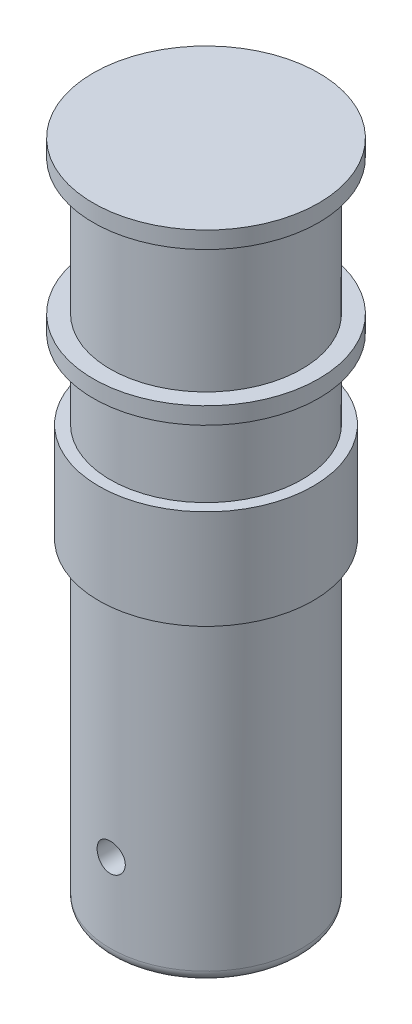
ISO-10303-21;
HEADER;
FILE_DESCRIPTION(('STEP AP214'),'2;1');
FILE_NAME('part.step','',(''),(''),'','','');
FILE_SCHEMA(('AUTOMOTIVE_DESIGN { 1 0 10303 214 1 1 1 1 }'));
ENDSEC;
DATA;
#1=APPLICATION_CONTEXT('core data for automotive mechanical design processes');
#2=APPLICATION_PROTOCOL_DEFINITION('international standard','automotive_design',2000,#1);
#3=PRODUCT_CONTEXT('',#1,'mechanical');
#4=PRODUCT('Part','Part','',(#3));
#5=PRODUCT_RELATED_PRODUCT_CATEGORY('part','',(#4));
#6=PRODUCT_DEFINITION_FORMATION('','',#4);
#7=PRODUCT_DEFINITION_CONTEXT('part definition',#1,'design');
#8=PRODUCT_DEFINITION('design','',#6,#7);
#9=PRODUCT_DEFINITION_SHAPE('','',#8);
#10=(LENGTH_UNIT() NAMED_UNIT(*) SI_UNIT(.MILLI.,.METRE.));
#11=(NAMED_UNIT(*) PLANE_ANGLE_UNIT() SI_UNIT($,.RADIAN.));
#12=(NAMED_UNIT(*) SI_UNIT($,.STERADIAN.) SOLID_ANGLE_UNIT());
#13=UNCERTAINTY_MEASURE_WITH_UNIT(LENGTH_MEASURE(1.E-05),#10,'distance_accuracy_value','');
#14=(GEOMETRIC_REPRESENTATION_CONTEXT(3) GLOBAL_UNCERTAINTY_ASSIGNED_CONTEXT((#13)) GLOBAL_UNIT_ASSIGNED_CONTEXT((#10,
#11,#12)) REPRESENTATION_CONTEXT('',''));
#15=CARTESIAN_POINT('',(0.,0.,0.));
#16=DIRECTION('',(0.,0.,1.));
#17=DIRECTION('',(1.,0.,0.));
#18=AXIS2_PLACEMENT_3D('',#15,#16,#17);
#19=CARTESIAN_POINT('',(0.,-30.,0.));
#20=DIRECTION('',(0.,-1.,0.));
#21=DIRECTION('',(1.,0.,0.));
#22=AXIS2_PLACEMENT_3D('',#19,#20,#21);
#23=PLANE('',#22);
#24=CARTESIAN_POINT('',(0.,-30.,0.));
#25=DIRECTION('',(0.,1.,0.));
#26=DIRECTION('',(-1.,0.,0.));
#27=AXIS2_PLACEMENT_3D('',#24,#25,#26);
#28=CIRCLE('',#27,4.);
#29=CARTESIAN_POINT('',(-4.,-30.,0.));
#30=VERTEX_POINT('',#29);
#31=EDGE_CURVE('E54',#30,#30,#28,.T.);
#32=ORIENTED_EDGE('',*,*,#31,.F.);
#33=EDGE_LOOP('',(#32));
#34=FACE_BOUND('',#33,.T.);
#35=ADVANCED_FACE('F34',(#34),#23,.T.);
#36=CARTESIAN_POINT('',(0.,15.,0.));
#37=DIRECTION('',(0.,1.,0.));
#38=DIRECTION('',(-1.,0.,0.));
#39=AXIS2_PLACEMENT_3D('',#36,#37,#38);
#40=CYLINDRICAL_SURFACE('',#39,4.);
#41=CARTESIAN_POINT('',(-1.25,-36.,3.79967103839267));
#42=CARTESIAN_POINT('',(-1.24999953780047,-35.9316529638907,3.79967145961936));
#43=CARTESIAN_POINT('',(-1.24437538791494,-35.8633012312968,3.80153531505043));
#44=CARTESIAN_POINT('',(-1.22209175401327,-35.7286058391222,3.80875638998877));
#45=CARTESIAN_POINT('',(-1.20542928782515,-35.6622627272678,3.81411455353136));
#46=CARTESIAN_POINT('',(-1.16169788223559,-35.533555098068,3.8276593883596));
#47=CARTESIAN_POINT('',(-1.13464735736677,-35.4711837668943,3.83584105194317));
#48=CARTESIAN_POINT('',(-1.07096914173157,-35.351847304136,3.85410406218688));
#49=CARTESIAN_POINT('',(-1.03433975905632,-35.2948831300399,3.86418574435841));
#50=CARTESIAN_POINT('',(-0.951196070622293,-35.1860211325065,3.8855012766862));
#51=CARTESIAN_POINT('',(-0.904409399720399,-35.134336390564,3.8967612338478));
#52=CARTESIAN_POINT('',(-0.802862046455494,-35.0394039867908,3.91894245860336));
#53=CARTESIAN_POINT('',(-0.748100252518563,-34.9961575030552,3.92986367872627));
#54=CARTESIAN_POINT('',(-0.630625912493361,-34.9183889369888,3.95043553390078));
#55=CARTESIAN_POINT('',(-0.567761556520095,-34.8840862961685,3.9600518456278));
#56=CARTESIAN_POINT('',(-0.436804232853405,-34.8266239501445,3.97662551833019));
#57=CARTESIAN_POINT('',(-0.368712498487054,-34.8034616258504,3.98358350419919));
#58=CARTESIAN_POINT('',(-0.231464356966101,-34.7696488719029,3.99387175820862));
#59=CARTESIAN_POINT('',(-0.162405715468218,-34.7586342502121,3.99730738984143));
#60=CARTESIAN_POINT('',(-0.0233408139845228,-34.7482756535625,4.00053595876015));
#61=CARTESIAN_POINT('',(0.0466652269730812,-34.7489290256412,4.00032972410065));
#62=CARTESIAN_POINT('',(0.183074480354733,-34.7616482915859,3.99637116132537));
#63=CARTESIAN_POINT('',(0.249518634314043,-34.773319383513,3.99274150972157));
#64=CARTESIAN_POINT('',(0.37945306334777,-34.807094990043,3.98249482560855));
#65=CARTESIAN_POINT('',(0.442943145481195,-34.8292001850865,3.97587759827134));
#66=CARTESIAN_POINT('',(0.566078103154782,-34.8834701890749,3.96023459729533));
#67=CARTESIAN_POINT('',(0.625666405622832,-34.915754808563,3.95118033616957));
#68=CARTESIAN_POINT('',(0.73870251115203,-34.9893710997046,3.93161722953562));
#69=CARTESIAN_POINT('',(0.792148756208837,-35.0307050591378,3.92110801644584));
#70=CARTESIAN_POINT('',(0.89373769845388,-35.1232736348013,3.89923670734646));
#71=CARTESIAN_POINT('',(0.941566549094178,-35.1748490688412,3.88785731989084));
#72=CARTESIAN_POINT('',(1.02798974259538,-35.2853951018245,3.86590615440413));
#73=CARTESIAN_POINT('',(1.06658299775341,-35.344366570575,3.85533447159847));
#74=CARTESIAN_POINT('',(1.13380465019765,-35.4689174688598,3.83610846648974));
#75=CARTESIAN_POINT('',(1.16231680702682,-35.5345634090424,3.82747690354324));
#76=CARTESIAN_POINT('',(1.20778345948513,-35.6700594918954,3.81337545338913));
#77=CARTESIAN_POINT('',(1.22474210765793,-35.7399081142105,3.80790443033294));
#78=CARTESIAN_POINT('',(1.24601485185708,-35.8788199525658,3.80099563391872));
#79=CARTESIAN_POINT('',(1.25080954353711,-35.9478019962321,3.79940466389696));
#80=CARTESIAN_POINT('',(1.24896744498307,-36.0855897414982,3.80001077463984));
#81=CARTESIAN_POINT('',(1.24233242111456,-36.1543954687005,3.80220727008389));
#82=CARTESIAN_POINT('',(1.21824873513143,-36.2878082966516,3.80998957482874));
#83=CARTESIAN_POINT('',(1.20111831160538,-36.352479274074,3.81547554101732));
#84=CARTESIAN_POINT('',(1.15690373661027,-36.478021791996,3.82911287331661));
#85=CARTESIAN_POINT('',(1.12981796171155,-36.5388927109212,3.83726467412388));
#86=CARTESIAN_POINT('',(1.06557510655875,-36.6570391097718,3.85560539653156));
#87=CARTESIAN_POINT('',(1.02815147488557,-36.7141614155928,3.86584603489733));
#88=CARTESIAN_POINT('',(0.94460640867981,-36.8214903463619,3.88710348972828));
#89=CARTESIAN_POINT('',(0.898482714690782,-36.8716951689253,3.89812050735703));
#90=CARTESIAN_POINT('',(0.796572947753603,-36.9659103659128,3.92024187562679));
#91=CARTESIAN_POINT('',(0.740465649788519,-37.0095777861399,3.9313309228568));
#92=CARTESIAN_POINT('',(0.621451545651397,-37.0868910433212,3.95189059843678));
#93=CARTESIAN_POINT('',(0.558545051108624,-37.120537339311,3.96136130090946));
#94=CARTESIAN_POINT('',(0.428105523331833,-37.1765305624717,3.97756311928512));
#95=CARTESIAN_POINT('',(0.360610184283756,-37.1989592878437,3.984313995612));
#96=CARTESIAN_POINT('',(0.222557254056389,-37.2320725385897,3.99440242648576));
#97=CARTESIAN_POINT('',(0.152000628340356,-37.2427607390835,3.99774104914277));
#98=CARTESIAN_POINT('',(0.0129849366488986,-37.2517910017496,4.00055803404462));
#99=CARTESIAN_POINT('',(-0.0554391919465221,-37.2506284501708,4.0001912940739));
#100=CARTESIAN_POINT('',(-0.191073221923248,-37.2371881889513,3.99600978081049));
#101=CARTESIAN_POINT('',(-0.258283202179568,-37.224911204008,3.99219523232619));
#102=CARTESIAN_POINT('',(-0.388755118480791,-37.1899059907777,3.98159570844796));
#103=CARTESIAN_POINT('',(-0.45205591844948,-37.1673103921546,3.97484847960205));
#104=CARTESIAN_POINT('',(-0.57399842550009,-37.1124291727915,3.9590794558795));
#105=CARTESIAN_POINT('',(-0.632639331274481,-37.0801418900266,3.95005727091358));
#106=CARTESIAN_POINT('',(-0.745761694969688,-37.0055272416555,3.93029896883376));
#107=CARTESIAN_POINT('',(-0.80003460705311,-36.962896477536,3.91951509750962));
#108=CARTESIAN_POINT('',(-0.900820791399316,-36.8693401105565,3.89758736547061));
#109=CARTESIAN_POINT('',(-0.947331733504156,-36.8184120258606,3.88644339784827));
#110=CARTESIAN_POINT('',(-1.03282865911252,-36.7076842801589,3.86461892577438));
#111=CARTESIAN_POINT('',(-1.07151427994711,-36.6476465968834,3.85396600863456));
#112=CARTESIAN_POINT('',(-1.13820470748522,-36.5216018797309,3.83480125279531));
#113=CARTESIAN_POINT('',(-1.16621383403546,-36.4555972735497,3.82628854861386));
#114=CARTESIAN_POINT('',(-1.20871180435792,-36.3252773826853,3.81306560440327));
#115=CARTESIAN_POINT('',(-1.22414939837873,-36.2612974525484,3.80809315043749));
#116=CARTESIAN_POINT('',(-1.24479245816099,-36.1315461679035,3.80139606482399));
#117=CARTESIAN_POINT('',(-1.25000044480778,-36.0657752587985,3.79967063301598));
#118=CARTESIAN_POINT('',(-1.25,-36.,3.79967103839267));
#119=B_SPLINE_CURVE_WITH_KNOTS('',3,(#41,#42,#43,#44,#45,#46,#47,#48,#49,#50,#51,#52,#53,#54,
#55,#56,#57,#58,#59,#60,#61,#62,#63,#64,#65,#66,#67,#68,#69,#70,#71,#72,#73,#74,#75,#76,#77,#78,
#79,#80,#81,#82,#83,#84,#85,#86,#87,#88,#89,#90,#91,#92,#93,#94,#95,#96,#97,#98,#99,#100,#101,
#102,#103,#104,#105,#106,#107,#108,#109,#110,#111,#112,#113,#114,#115,#116,#117,#118),
.UNSPECIFIED.,.T.,.F.,(4,2,2,2,2,2,2,2,2,2,2,2,2,2,2,2,2,2,2,2,2,2,2,2,2,2,2,2,2,2,2,2,2,2,2,2,
2,2,4),(0.,0.204798137548501,0.409651627059736,0.614143644118579,0.818671804924945,
1.02957080550838,1.24049922941123,1.45619821963733,1.67184647417921,1.88083722835533,
2.08978046471774,2.2915098296975,2.49325235190093,2.69746404608409,2.90172742713188,
3.11450338937334,3.32730439853776,3.54248470934454,3.75758763952753,3.96404933287934,
4.17047912219088,4.37093972044362,4.5714330225321,4.7776761330961,4.9839728801188,
5.19881937811511,5.41365603317086,5.62690239290998,5.84008198140585,6.04438802439524,
6.24868074692306,6.45041846514759,6.65219079911652,6.86080693105214,7.06948557772189,
7.28507795501704,7.50058300803822,7.69772354371386,7.89481549188778),.UNSPECIFIED.);
#120=CARTESIAN_POINT('',(-1.25,-36.,3.79967103839267));
#121=VERTEX_POINT('',#120);
#122=EDGE_CURVE('E90',#121,#121,#119,.T.);
#123=ORIENTED_EDGE('',*,*,#122,.F.);
#124=EDGE_LOOP('',(#123));
#125=FACE_BOUND('',#124,.T.);
#126=CARTESIAN_POINT('',(0.,-43.,0.));
#127=DIRECTION('',(0.,-1.,0.));
#128=DIRECTION('',(1.,0.,0.));
#129=AXIS2_PLACEMENT_3D('',#126,#127,#128);
#130=CIRCLE('',#129,4.);
#131=CARTESIAN_POINT('',(4.,-43.,0.));
#132=VERTEX_POINT('',#131);
#133=EDGE_CURVE('E10',#132,#132,#130,.T.);
#134=ORIENTED_EDGE('',*,*,#133,.T.);
#135=EDGE_LOOP('',(#134));
#136=FACE_BOUND('',#135,.T.);
#137=ORIENTED_EDGE('',*,*,#31,.T.);
#138=EDGE_LOOP('',(#137));
#139=FACE_BOUND('',#138,.T.);
#140=ADVANCED_FACE('F103',(#125,#136,#139),#40,.F.);
#141=CARTESIAN_POINT('',(-4.,-44.,0.));
#142=DIRECTION('',(0.,-1.,0.));
#143=DIRECTION('',(1.,0.,0.));
#144=AXIS2_PLACEMENT_3D('',#141,#142,#143);
#145=PLANE('',#144);
#146=CARTESIAN_POINT('',(0.,-44.,0.));
#147=DIRECTION('',(0.,-1.,0.));
#148=DIRECTION('',(1.,0.,0.));
#149=AXIS2_PLACEMENT_3D('',#146,#147,#148);
#150=CIRCLE('',#149,7.49999999999999);
#151=CARTESIAN_POINT('',(7.49999999999999,-44.,0.));
#152=VERTEX_POINT('',#151);
#153=EDGE_CURVE('E41',#152,#152,#150,.T.);
#154=ORIENTED_EDGE('',*,*,#153,.T.);
#155=EDGE_LOOP('',(#154));
#156=FACE_BOUND('',#155,.T.);
#157=CARTESIAN_POINT('',(0.,-44.,0.));
#158=DIRECTION('',(0.,-1.,0.));
#159=DIRECTION('',(1.,0.,0.));
#160=AXIS2_PLACEMENT_3D('',#157,#158,#159);
#161=CIRCLE('',#160,5.);
#162=CARTESIAN_POINT('',(5.,-44.,0.));
#163=VERTEX_POINT('',#162);
#164=EDGE_CURVE('E45',#163,#163,#161,.F.);
#165=ORIENTED_EDGE('',*,*,#164,.T.);
#166=EDGE_LOOP('',(#165));
#167=FACE_BOUND('',#166,.T.);
#168=ADVANCED_FACE('F161',(#156,#167),#145,.T.);
#169=CARTESIAN_POINT('',(0.,15.,0.));
#170=DIRECTION('',(0.,1.,0.));
#171=DIRECTION('',(-1.,0.,0.));
#172=AXIS2_PLACEMENT_3D('',#169,#170,#171);
#173=CYLINDRICAL_SURFACE('',#172,8.49999999999999);
#174=CARTESIAN_POINT('',(-1.25,-36.,8.40758586040011));
#175=CARTESIAN_POINT('',(-1.24999710510227,-36.0698045307349,8.40758700940734));
#176=CARTESIAN_POINT('',(-1.24413302561147,-36.1396499774146,8.408464600162));
#177=CARTESIAN_POINT('',(-1.22083722377046,-36.2773892099967,8.41187789658696));
#178=CARTESIAN_POINT('',(-1.20339411636137,-36.3452810063584,8.41441523416455));
#179=CARTESIAN_POINT('',(-1.15747242113108,-36.4770991959618,8.42085456460098));
#180=CARTESIAN_POINT('',(-1.12900217790827,-36.5410285453842,8.42475552534398));
#181=CARTESIAN_POINT('',(-1.06185381528303,-36.6631932019976,8.43348133440081));
#182=CARTESIAN_POINT('',(-1.02317714404783,-36.7214293153837,8.43830605161827));
#183=CARTESIAN_POINT('',(-0.936395680627589,-36.8310121715149,8.44837729235549));
#184=CARTESIAN_POINT('',(-0.888227811627049,-36.882308722437,8.45362649120866));
#185=CARTESIAN_POINT('',(-0.783967427241611,-36.9761215515143,8.46393134335555));
#186=CARTESIAN_POINT('',(-0.727874481842022,-37.0186373529176,8.46898698612797));
#187=CARTESIAN_POINT('',(-0.60903536272514,-37.093866414533,8.4783630159218));
#188=CARTESIAN_POINT('',(-0.546259688480514,-37.1265335461939,8.48267990326488));
#189=CARTESIAN_POINT('',(-0.416038601354241,-37.1808420195621,8.49006242091287));
#190=CARTESIAN_POINT('',(-0.348593426034827,-37.2024839217137,8.49312811481799));
#191=CARTESIAN_POINT('',(-0.211464398495231,-37.2339757010046,8.49764395451441));
#192=CARTESIAN_POINT('',(-0.141800218809728,-37.2439095651021,8.49910560156349));
#193=CARTESIAN_POINT('',(-0.00177945680603142,-37.2519640047736,8.50028806047439));
#194=CARTESIAN_POINT('',(0.068577088244074,-37.2500852127547,8.50000896552926));
#195=CARTESIAN_POINT('',(0.20741260926797,-37.2346340815761,8.49775059098031));
#196=CARTESIAN_POINT('',(0.275901884682537,-37.2211520951745,8.49578444857936));
#197=CARTESIAN_POINT('',(0.409635277137452,-37.1830190301375,8.49038753926088));
#198=CARTESIAN_POINT('',(0.474879313262815,-37.158367673166,8.48695673584472));
#199=CARTESIAN_POINT('',(0.600544454522743,-37.0985026788097,8.47899339387314));
#200=CARTESIAN_POINT('',(0.66094711365584,-37.0632508702462,8.47445688515938));
#201=CARTESIAN_POINT('',(0.775013746624383,-36.9832134973463,8.46478797434031));
#202=CARTESIAN_POINT('',(0.828677293524276,-36.9384273294741,8.45965553452124));
#203=CARTESIAN_POINT('',(0.928274771197664,-36.8400888692555,8.44931012765942));
#204=CARTESIAN_POINT('',(0.97413083344061,-36.7864577081385,8.44409685803329));
#205=CARTESIAN_POINT('',(1.05620396332034,-36.6722199852064,8.43422475926411));
#206=CARTESIAN_POINT('',(1.09242097588368,-36.6116133835396,8.429565933289));
#207=CARTESIAN_POINT('',(1.15419768439827,-36.4850655107819,8.42133032189468));
#208=CARTESIAN_POINT('',(1.17974960098851,-36.4191203873688,8.41775432683684));
#209=CARTESIAN_POINT('',(1.21939363445995,-36.2838104313511,8.41210341899182));
#210=CARTESIAN_POINT('',(1.23348652609985,-36.2144458302779,8.41002840472255));
#211=CARTESIAN_POINT('',(1.24970613657199,-36.074958088404,8.40763356673708));
#212=CARTESIAN_POINT('',(1.25194313773078,-36.0048480391685,8.40729756756401));
#213=CARTESIAN_POINT('',(1.2446798881272,-35.8652540518017,8.4083758794971));
#214=CARTESIAN_POINT('',(1.23517998693919,-35.7957700950848,8.40979013847321));
#215=CARTESIAN_POINT('',(1.20480604960235,-35.6597409257275,8.41419476930311));
#216=CARTESIAN_POINT('',(1.18398676081403,-35.5931832213757,8.41717755257087));
#217=CARTESIAN_POINT('',(1.13162190536935,-35.4645023379237,8.4243769039173));
#218=CARTESIAN_POINT('',(1.10007582796816,-35.4023793701493,8.42859353074283));
#219=CARTESIAN_POINT('',(1.02688712390612,-35.283836456236,8.43782365247836));
#220=CARTESIAN_POINT('',(0.985172989894867,-35.2274610987134,8.44284270041291));
#221=CARTESIAN_POINT('',(0.892931901207418,-35.1224716244546,8.45309533274159));
#222=CARTESIAN_POINT('',(0.842404468153765,-35.0738579292883,8.45832892876937));
#223=CARTESIAN_POINT('',(0.733485882129778,-34.9853767814535,8.46847140977382));
#224=CARTESIAN_POINT('',(0.675035107129501,-34.945582337148,8.47337736523611));
#225=CARTESIAN_POINT('',(0.552214316327246,-34.8763775225772,8.48226649910813));
#226=CARTESIAN_POINT('',(0.487844457355889,-34.8469668772851,8.48624970195704));
#227=CARTESIAN_POINT('',(0.355242512242695,-34.7994816728052,8.4928316761749));
#228=CARTESIAN_POINT('',(0.287025077389443,-34.7813669085891,8.49543535260939));
#229=CARTESIAN_POINT('',(0.14847554116671,-34.756857469766,8.49898547341227));
#230=CARTESIAN_POINT('',(0.0781435740928535,-34.7504620524455,8.49993202280091));
#231=CARTESIAN_POINT('',(-0.0619298668379421,-34.7495904384732,8.50006025774637));
#232=CARTESIAN_POINT('',(-0.131670655626724,-34.7550024258134,8.49925849979376));
#233=CARTESIAN_POINT('',(-0.269239179820508,-34.7773526840448,8.49601352815675));
#234=CARTESIAN_POINT('',(-0.337066920661136,-34.7942909221824,8.49357031913676));
#235=CARTESIAN_POINT('',(-0.468855272056404,-34.8391737577989,8.48731568295444));
#236=CARTESIAN_POINT('',(-0.532818464760777,-34.8671109102611,8.48350518144819));
#237=CARTESIAN_POINT('',(-0.655166929115878,-34.9331866771456,8.47493492093455));
#238=CARTESIAN_POINT('',(-0.713552033805032,-34.9713255967943,8.4701751335266));
#239=CARTESIAN_POINT('',(-0.8236546964664,-35.057127837482,8.46018209258476));
#240=CARTESIAN_POINT('',(-0.875307495715042,-35.1048738136239,8.45494496231288));
#241=CARTESIAN_POINT('',(-0.969908817337543,-35.208361010639,8.44461647463574));
#242=CARTESIAN_POINT('',(-1.01285529235081,-35.2641041068472,8.43952515175939));
#243=CARTESIAN_POINT('',(-1.08903160606815,-35.3823554895497,8.43003535108944));
#244=CARTESIAN_POINT('',(-1.12220785319988,-35.4448986035356,8.4256407535303));
#245=CARTESIAN_POINT('',(-1.17753570240274,-35.5747037247093,8.41808744433526));
#246=CARTESIAN_POINT('',(-1.19969881567852,-35.6419607205442,8.41492744301018));
#247=CARTESIAN_POINT('',(-1.22730605825343,-35.7579382510754,8.41093594969734));
#248=CARTESIAN_POINT('',(-1.23580336635801,-35.8059403764295,8.40968627498973));
#249=CARTESIAN_POINT('',(-1.24715131261068,-35.9026217018971,8.40801083456298));
#250=CARTESIAN_POINT('',(-1.25000201962438,-35.9513008937459,8.40758505879562));
#251=CARTESIAN_POINT('',(-1.25,-36.,8.40758586040011));
#252=B_SPLINE_CURVE_WITH_KNOTS('',3,(#174,#175,#176,#177,#178,#179,#180,#181,#182,#183,#184,
#185,#186,#187,#188,#189,#190,#191,#192,#193,#194,#195,#196,#197,#198,#199,#200,#201,#202,#203,
#204,#205,#206,#207,#208,#209,#210,#211,#212,#213,#214,#215,#216,#217,#218,#219,#220,#221,#222,
#223,#224,#225,#226,#227,#228,#229,#230,#231,#232,#233,#234,#235,#236,#237,#238,#239,#240,#241,
#242,#243,#244,#245,#246,#247,#248,#249,#250,#251),.UNSPECIFIED.,.T.,.F.,(4,2,2,2,2,2,2,2,2,2,2,
2,2,2,2,2,2,2,2,2,2,2,2,2,2,2,2,2,2,2,2,2,2,2,2,2,2,2,4),(0.,0.209235604041352,
0.418677243956451,0.627960701137757,0.837214479508831,1.0479089137279,1.25861478462188,
1.47029273888423,1.68195993187107,1.8920993174321,2.10222745298405,2.3107339980099,
2.51924573921819,2.72851748935693,2.9378024905773,3.14906598586865,3.36033068820406,
3.57174922359478,3.78315346353081,3.99258774581621,4.20201579041742,4.41043981091345,
4.61887375669134,4.82881810275995,5.03877384795543,5.25040763301589,5.46203581229343,
5.67290638591942,5.88376359516139,6.09263266274005,6.30150113679018,6.51022847299387,
6.71896205480251,6.92957482323233,7.14023706160588,7.35203417379322,7.56360944219752,
7.70958436789297,7.85555751327589),.UNSPECIFIED.);
#253=CARTESIAN_POINT('',(-1.25,-36.,8.40758586040011));
#254=VERTEX_POINT('',#253);
#255=EDGE_CURVE('E98',#254,#254,#252,.T.);
#256=ORIENTED_EDGE('',*,*,#255,.F.);
#257=EDGE_LOOP('',(#256));
#258=FACE_BOUND('',#257,.T.);
#259=CARTESIAN_POINT('',(0.,-43.,0.));
#260=DIRECTION('',(0.,-1.,0.));
#261=DIRECTION('',(1.,0.,0.));
#262=AXIS2_PLACEMENT_3D('',#259,#260,#261);
#263=CIRCLE('',#262,8.49999999999999);
#264=CARTESIAN_POINT('',(8.49999999999999,-43.,0.));
#265=VERTEX_POINT('',#264);
#266=EDGE_CURVE('E49',#265,#265,#263,.F.);
#267=ORIENTED_EDGE('',*,*,#266,.T.);
#268=EDGE_LOOP('',(#267));
#269=FACE_BOUND('',#268,.T.);
#270=CARTESIAN_POINT('',(0.,-15.8,0.));
#271=DIRECTION('',(0.,1.,0.));
#272=DIRECTION('',(-1.,0.,0.));
#273=AXIS2_PLACEMENT_3D('',#270,#271,#272);
#274=CIRCLE('',#273,8.49999999999999);
#275=CARTESIAN_POINT('',(-8.49999999999999,-15.8,0.));
#276=VERTEX_POINT('',#275);
#277=EDGE_CURVE('E57',#276,#276,#274,.T.);
#278=ORIENTED_EDGE('',*,*,#277,.F.);
#279=EDGE_LOOP('',(#278));
#280=FACE_BOUND('',#279,.T.);
#281=ADVANCED_FACE('F158',(#258,#269,#280),#173,.T.);
#282=CARTESIAN_POINT('',(-8.49999999999999,-15.8,0.));
#283=DIRECTION('',(0.,-1.,0.));
#284=DIRECTION('',(1.,0.,0.));
#285=AXIS2_PLACEMENT_3D('',#282,#283,#284);
#286=PLANE('',#285);
#287=ORIENTED_EDGE('',*,*,#277,.T.);
#288=EDGE_LOOP('',(#287));
#289=FACE_BOUND('',#288,.T.);
#290=CARTESIAN_POINT('',(0.,-15.8,0.));
#291=DIRECTION('',(0.,1.,0.));
#292=DIRECTION('',(-1.,0.,0.));
#293=AXIS2_PLACEMENT_3D('',#290,#291,#292);
#294=CIRCLE('',#293,9.49999999999999);
#295=CARTESIAN_POINT('',(-9.49999999999999,-15.8,0.));
#296=VERTEX_POINT('',#295);
#297=EDGE_CURVE('E60',#296,#296,#294,.T.);
#298=ORIENTED_EDGE('',*,*,#297,.F.);
#299=EDGE_LOOP('',(#298));
#300=FACE_BOUND('',#299,.T.);
#301=ADVANCED_FACE('F154',(#289,#300),#286,.T.);
#302=CARTESIAN_POINT('',(0.,15.,0.));
#303=DIRECTION('',(0.,1.,0.));
#304=DIRECTION('',(-1.,0.,0.));
#305=AXIS2_PLACEMENT_3D('',#302,#303,#304);
#306=CYLINDRICAL_SURFACE('',#305,9.49999999999999);
#307=ORIENTED_EDGE('',*,*,#297,.T.);
#308=EDGE_LOOP('',(#307));
#309=FACE_BOUND('',#308,.T.);
#310=CARTESIAN_POINT('',(0.,-7.,0.));
#311=DIRECTION('',(0.,1.,0.));
#312=DIRECTION('',(-1.,0.,0.));
#313=AXIS2_PLACEMENT_3D('',#310,#311,#312);
#314=CIRCLE('',#313,9.49999999999999);
#315=CARTESIAN_POINT('',(-9.49999999999999,-7.,0.));
#316=VERTEX_POINT('',#315);
#317=EDGE_CURVE('E63',#316,#316,#314,.T.);
#318=ORIENTED_EDGE('',*,*,#317,.F.);
#319=EDGE_LOOP('',(#318));
#320=FACE_BOUND('',#319,.T.);
#321=ADVANCED_FACE('F150',(#309,#320),#306,.T.);
#322=CARTESIAN_POINT('',(-9.49999999999999,-7.,0.));
#323=DIRECTION('',(0.,1.,0.));
#324=DIRECTION('',(-1.,0.,0.));
#325=AXIS2_PLACEMENT_3D('',#322,#323,#324);
#326=PLANE('',#325);
#327=ORIENTED_EDGE('',*,*,#317,.T.);
#328=EDGE_LOOP('',(#327));
#329=FACE_BOUND('',#328,.T.);
#330=CARTESIAN_POINT('',(0.,-7.,0.));
#331=DIRECTION('',(0.,1.,0.));
#332=DIRECTION('',(-1.,0.,0.));
#333=AXIS2_PLACEMENT_3D('',#330,#331,#332);
#334=CIRCLE('',#333,8.49999999999999);
#335=CARTESIAN_POINT('',(-8.49999999999999,-7.,0.));
#336=VERTEX_POINT('',#335);
#337=EDGE_CURVE('E66',#336,#336,#334,.T.);
#338=ORIENTED_EDGE('',*,*,#337,.F.);
#339=EDGE_LOOP('',(#338));
#340=FACE_BOUND('',#339,.T.);
#341=ADVANCED_FACE('F146',(#329,#340),#326,.T.);
#342=CARTESIAN_POINT('',(0.,15.,0.));
#343=DIRECTION('',(0.,1.,0.));
#344=DIRECTION('',(-1.,0.,0.));
#345=AXIS2_PLACEMENT_3D('',#342,#343,#344);
#346=CYLINDRICAL_SURFACE('',#345,8.49999999999999);
#347=ORIENTED_EDGE('',*,*,#337,.T.);
#348=EDGE_LOOP('',(#347));
#349=FACE_BOUND('',#348,.T.);
#350=CARTESIAN_POINT('',(0.,0.,0.));
#351=DIRECTION('',(0.,1.,0.));
#352=DIRECTION('',(-1.,0.,0.));
#353=AXIS2_PLACEMENT_3D('',#350,#351,#352);
#354=CIRCLE('',#353,8.49999999999999);
#355=CARTESIAN_POINT('',(-8.49999999999999,0.,0.));
#356=VERTEX_POINT('',#355);
#357=EDGE_CURVE('E69',#356,#356,#354,.T.);
#358=ORIENTED_EDGE('',*,*,#357,.F.);
#359=EDGE_LOOP('',(#358));
#360=FACE_BOUND('',#359,.T.);
#361=ADVANCED_FACE('F142',(#349,#360),#346,.T.);
#362=CARTESIAN_POINT('',(-8.49999999999999,0.,0.));
#363=DIRECTION('',(0.,-1.,0.));
#364=DIRECTION('',(1.,0.,0.));
#365=AXIS2_PLACEMENT_3D('',#362,#363,#364);
#366=PLANE('',#365);
#367=ORIENTED_EDGE('',*,*,#357,.T.);
#368=EDGE_LOOP('',(#367));
#369=FACE_BOUND('',#368,.T.);
#370=CARTESIAN_POINT('',(0.,0.,0.));
#371=DIRECTION('',(0.,1.,0.));
#372=DIRECTION('',(-1.,0.,0.));
#373=AXIS2_PLACEMENT_3D('',#370,#371,#372);
#374=CIRCLE('',#373,10.);
#375=CARTESIAN_POINT('',(-10.,0.,0.));
#376=VERTEX_POINT('',#375);
#377=EDGE_CURVE('E72',#376,#376,#374,.T.);
#378=ORIENTED_EDGE('',*,*,#377,.F.);
#379=EDGE_LOOP('',(#378));
#380=FACE_BOUND('',#379,.T.);
#381=ADVANCED_FACE('F138',(#369,#380),#366,.T.);
#382=CARTESIAN_POINT('',(0.,15.,0.));
#383=DIRECTION('',(0.,1.,0.));
#384=DIRECTION('',(-1.,0.,0.));
#385=AXIS2_PLACEMENT_3D('',#382,#383,#384);
#386=CYLINDRICAL_SURFACE('',#385,10.);
#387=ORIENTED_EDGE('',*,*,#377,.T.);
#388=EDGE_LOOP('',(#387));
#389=FACE_BOUND('',#388,.T.);
#390=CARTESIAN_POINT('',(0.,1.5,0.));
#391=DIRECTION('',(0.,1.,0.));
#392=DIRECTION('',(-1.,0.,0.));
#393=AXIS2_PLACEMENT_3D('',#390,#391,#392);
#394=CIRCLE('',#393,10.);
#395=CARTESIAN_POINT('',(-10.,1.5,0.));
#396=VERTEX_POINT('',#395);
#397=EDGE_CURVE('E75',#396,#396,#394,.T.);
#398=ORIENTED_EDGE('',*,*,#397,.F.);
#399=EDGE_LOOP('',(#398));
#400=FACE_BOUND('',#399,.T.);
#401=ADVANCED_FACE('F134',(#389,#400),#386,.T.);
#402=CARTESIAN_POINT('',(-10.,1.5,0.));
#403=DIRECTION('',(0.,1.,0.));
#404=DIRECTION('',(-1.,0.,0.));
#405=AXIS2_PLACEMENT_3D('',#402,#403,#404);
#406=PLANE('',#405);
#407=ORIENTED_EDGE('',*,*,#397,.T.);
#408=EDGE_LOOP('',(#407));
#409=FACE_BOUND('',#408,.T.);
#410=CARTESIAN_POINT('',(0.,1.5,0.));
#411=DIRECTION('',(0.,1.,0.));
#412=DIRECTION('',(-1.,0.,0.));
#413=AXIS2_PLACEMENT_3D('',#410,#411,#412);
#414=CIRCLE('',#413,8.5);
#415=CARTESIAN_POINT('',(-8.5,1.5,0.));
#416=VERTEX_POINT('',#415);
#417=EDGE_CURVE('E78',#416,#416,#414,.T.);
#418=ORIENTED_EDGE('',*,*,#417,.F.);
#419=EDGE_LOOP('',(#418));
#420=FACE_BOUND('',#419,.T.);
#421=ADVANCED_FACE('F130',(#409,#420),#406,.T.);
#422=CARTESIAN_POINT('',(0.,15.,0.));
#423=DIRECTION('',(0.,1.,0.));
#424=DIRECTION('',(-1.,0.,0.));
#425=AXIS2_PLACEMENT_3D('',#422,#423,#424);
#426=CYLINDRICAL_SURFACE('',#425,8.5);
#427=ORIENTED_EDGE('',*,*,#417,.T.);
#428=EDGE_LOOP('',(#427));
#429=FACE_BOUND('',#428,.T.);
#430=CARTESIAN_POINT('',(0.,13.5,0.));
#431=DIRECTION('',(0.,1.,0.));
#432=DIRECTION('',(-1.,0.,0.));
#433=AXIS2_PLACEMENT_3D('',#430,#431,#432);
#434=CIRCLE('',#433,8.5);
#435=CARTESIAN_POINT('',(-8.5,13.5,0.));
#436=VERTEX_POINT('',#435);
#437=EDGE_CURVE('E81',#436,#436,#434,.T.);
#438=ORIENTED_EDGE('',*,*,#437,.F.);
#439=EDGE_LOOP('',(#438));
#440=FACE_BOUND('',#439,.T.);
#441=ADVANCED_FACE('F126',(#429,#440),#426,.T.);
#442=CARTESIAN_POINT('',(-8.5,13.5,0.));
#443=DIRECTION('',(0.,-1.,0.));
#444=DIRECTION('',(1.,0.,0.));
#445=AXIS2_PLACEMENT_3D('',#442,#443,#444);
#446=PLANE('',#445);
#447=ORIENTED_EDGE('',*,*,#437,.T.);
#448=EDGE_LOOP('',(#447));
#449=FACE_BOUND('',#448,.T.);
#450=CARTESIAN_POINT('',(0.,13.5,0.));
#451=DIRECTION('',(0.,1.,0.));
#452=DIRECTION('',(-1.,0.,0.));
#453=AXIS2_PLACEMENT_3D('',#450,#451,#452);
#454=CIRCLE('',#453,10.);
#455=CARTESIAN_POINT('',(-10.,13.5,0.));
#456=VERTEX_POINT('',#455);
#457=EDGE_CURVE('E84',#456,#456,#454,.T.);
#458=ORIENTED_EDGE('',*,*,#457,.F.);
#459=EDGE_LOOP('',(#458));
#460=FACE_BOUND('',#459,.T.);
#461=ADVANCED_FACE('F122',(#449,#460),#446,.T.);
#462=CARTESIAN_POINT('',(0.,15.,0.));
#463=DIRECTION('',(0.,1.,0.));
#464=DIRECTION('',(-1.,0.,0.));
#465=AXIS2_PLACEMENT_3D('',#462,#463,#464);
#466=CYLINDRICAL_SURFACE('',#465,10.);
#467=ORIENTED_EDGE('',*,*,#457,.T.);
#468=EDGE_LOOP('',(#467));
#469=FACE_BOUND('',#468,.T.);
#470=CARTESIAN_POINT('',(0.,15.,0.));
#471=DIRECTION('',(0.,1.,0.));
#472=DIRECTION('',(-1.,0.,0.));
#473=AXIS2_PLACEMENT_3D('',#470,#471,#472);
#474=CIRCLE('',#473,10.);
#475=CARTESIAN_POINT('',(-10.,15.,0.));
#476=VERTEX_POINT('',#475);
#477=EDGE_CURVE('E87',#476,#476,#474,.T.);
#478=ORIENTED_EDGE('',*,*,#477,.F.);
#479=EDGE_LOOP('',(#478));
#480=FACE_BOUND('',#479,.T.);
#481=ADVANCED_FACE('F118',(#469,#480),#466,.T.);
#482=CARTESIAN_POINT('',(-10.,15.,0.));
#483=DIRECTION('',(0.,1.,0.));
#484=DIRECTION('',(-1.,0.,0.));
#485=AXIS2_PLACEMENT_3D('',#482,#483,#484);
#486=PLANE('',#485);
#487=ORIENTED_EDGE('',*,*,#477,.T.);
#488=EDGE_LOOP('',(#487));
#489=FACE_BOUND('',#488,.T.);
#490=ADVANCED_FACE('F114',(#489),#486,.T.);
#491=CARTESIAN_POINT('',(0.,-43.,0.));
#492=DIRECTION('',(0.,-1.,0.));
#493=DIRECTION('',(1.,0.,0.));
#494=AXIS2_PLACEMENT_3D('',#491,#492,#493);
#495=TOROIDAL_SURFACE('',#494,7.49999999999999,1.);
#496=ORIENTED_EDGE('',*,*,#153,.F.);
#497=EDGE_LOOP('',(#496));
#498=FACE_BOUND('',#497,.T.);
#499=ORIENTED_EDGE('',*,*,#266,.F.);
#500=EDGE_LOOP('',(#499));
#501=FACE_BOUND('',#500,.T.);
#502=ADVANCED_FACE('F117',(#498,#501),#495,.T.);
#503=CARTESIAN_POINT('',(0.,-43.,0.));
#504=DIRECTION('',(0.,-1.,0.));
#505=DIRECTION('',(1.,0.,0.));
#506=AXIS2_PLACEMENT_3D('',#503,#504,#505);
#507=TOROIDAL_SURFACE('',#506,5.,1.);
#508=ORIENTED_EDGE('',*,*,#133,.F.);
#509=EDGE_LOOP('',(#508));
#510=FACE_BOUND('',#509,.T.);
#511=ORIENTED_EDGE('',*,*,#164,.F.);
#512=EDGE_LOOP('',(#511));
#513=FACE_BOUND('',#512,.T.);
#514=ADVANCED_FACE('F36',(#510,#513),#507,.T.);
#515=CARTESIAN_POINT('',(0.,-36.,0.));
#516=DIRECTION('',(0.,0.,-1.));
#517=DIRECTION('',(-1.,0.,0.));
#518=AXIS2_PLACEMENT_3D('',#515,#516,#517);
#519=CYLINDRICAL_SURFACE('',#518,1.25);
#520=ORIENTED_EDGE('',*,*,#122,.T.);
#521=EDGE_LOOP('',(#520));
#522=FACE_BOUND('',#521,.T.);
#523=ORIENTED_EDGE('',*,*,#255,.T.);
#524=EDGE_LOOP('',(#523));
#525=FACE_BOUND('',#524,.T.);
#526=ADVANCED_FACE('F107',(#522,#525),#519,.F.);
#527=CLOSED_SHELL('',(#35,#140,#168,#281,#301,#321,#341,#361,#381,#401,#421,#441,#461,#481,#490,
#502,#514,#526));
#528=MANIFOLD_SOLID_BREP('B2',#527);
#529=ADVANCED_BREP_SHAPE_REPRESENTATION('',(#18,#528),#14);
#530=SHAPE_DEFINITION_REPRESENTATION(#9,#529);
ENDSEC;
END-ISO-10303-21;
